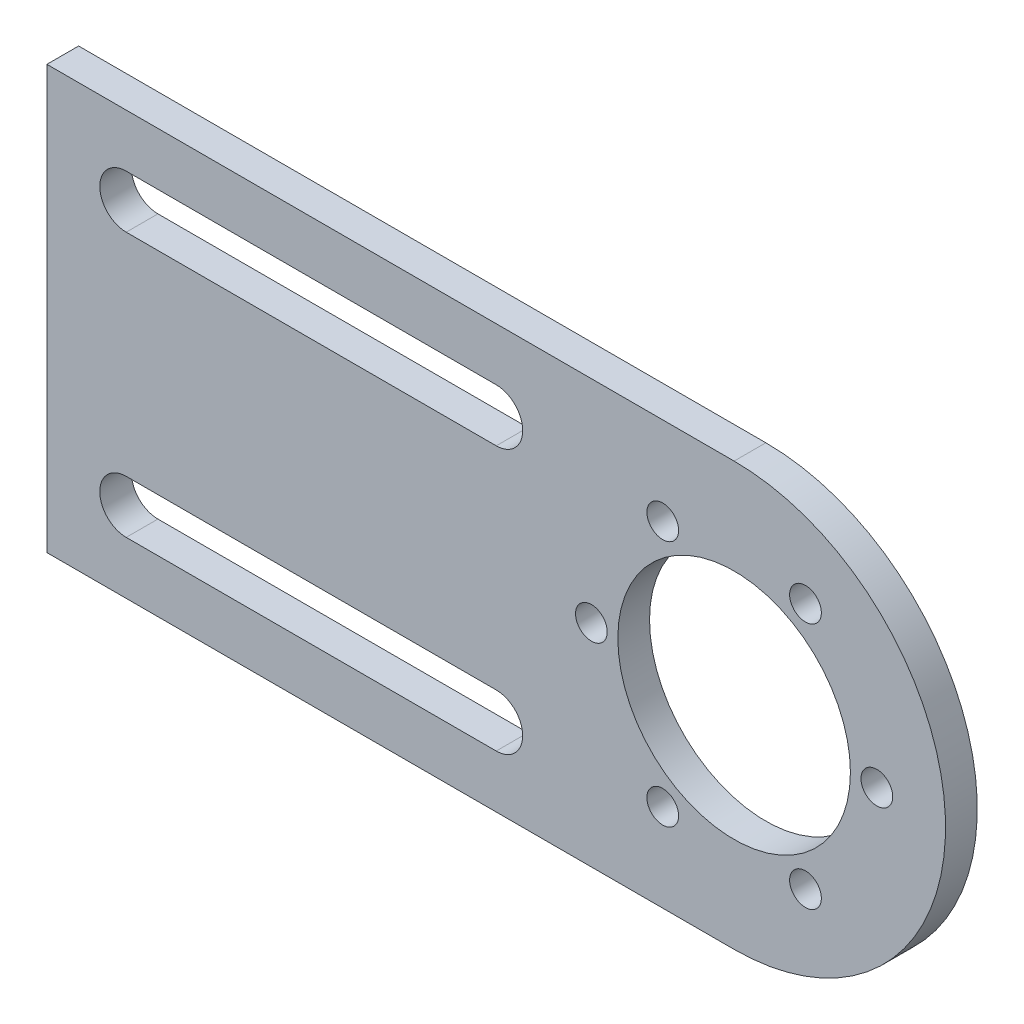
ISO-10303-21;
HEADER;
FILE_DESCRIPTION(('STEP AP214'),'2;1');
FILE_NAME('part.step','',(''),(''),'','','');
FILE_SCHEMA(('AUTOMOTIVE_DESIGN { 1 0 10303 214 1 1 1 1 }'));
ENDSEC;
DATA;
#1=APPLICATION_CONTEXT('core data for automotive mechanical design processes');
#2=APPLICATION_PROTOCOL_DEFINITION('international standard','automotive_design',2000,#1);
#3=PRODUCT_CONTEXT('',#1,'mechanical');
#4=PRODUCT('Part','Part','',(#3));
#5=PRODUCT_RELATED_PRODUCT_CATEGORY('part','',(#4));
#6=PRODUCT_DEFINITION_FORMATION('','',#4);
#7=PRODUCT_DEFINITION_CONTEXT('part definition',#1,'design');
#8=PRODUCT_DEFINITION('design','',#6,#7);
#9=PRODUCT_DEFINITION_SHAPE('','',#8);
#10=(LENGTH_UNIT() NAMED_UNIT(*) SI_UNIT(.MILLI.,.METRE.));
#11=(NAMED_UNIT(*) PLANE_ANGLE_UNIT() SI_UNIT($,.RADIAN.));
#12=(NAMED_UNIT(*) SI_UNIT($,.STERADIAN.) SOLID_ANGLE_UNIT());
#13=UNCERTAINTY_MEASURE_WITH_UNIT(LENGTH_MEASURE(1.E-05),#10,'distance_accuracy_value','');
#14=(GEOMETRIC_REPRESENTATION_CONTEXT(3) GLOBAL_UNCERTAINTY_ASSIGNED_CONTEXT((#13)) GLOBAL_UNIT_ASSIGNED_CONTEXT((#10,
#11,#12)) REPRESENTATION_CONTEXT('',''));
#15=CARTESIAN_POINT('',(0.,0.,0.));
#16=DIRECTION('',(0.,0.,1.));
#17=DIRECTION('',(1.,0.,0.));
#18=AXIS2_PLACEMENT_3D('',#15,#16,#17);
#19=CARTESIAN_POINT('',(32.5,0.,3.));
#20=DIRECTION('',(0.,0.,-1.));
#21=DIRECTION('',(-1.,0.,0.));
#22=AXIS2_PLACEMENT_3D('',#19,#20,#21);
#23=PLANE('',#22);
#24=CARTESIAN_POINT('',(39.2500000000001,11.6913429510898,3.));
#25=DIRECTION('',(0.,0.,1.));
#26=DIRECTION('',(0.50000000000001,0.866025403784433,0.));
#27=AXIS2_PLACEMENT_3D('',#24,#25,#26);
#28=CIRCLE('',#27,1.5);
#29=CARTESIAN_POINT('',(40.0000000000001,12.9903810567665,3.));
#30=VERTEX_POINT('',#29);
#31=EDGE_CURVE('E360',#30,#30,#28,.T.);
#32=ORIENTED_EDGE('',*,*,#31,.F.);
#33=EDGE_LOOP('',(#32));
#34=FACE_BOUND('',#33,.T.);
#35=CARTESIAN_POINT('',(25.7500000000001,11.69134295109,3.));
#36=DIRECTION('',(0.,0.,1.));
#37=DIRECTION('',(-0.499999999999992,0.866025403784443,0.));
#38=AXIS2_PLACEMENT_3D('',#35,#36,#37);
#39=CIRCLE('',#38,1.5);
#40=CARTESIAN_POINT('',(25.0000000000001,12.9903810567666,3.));
#41=VERTEX_POINT('',#40);
#42=EDGE_CURVE('E354',#41,#41,#39,.T.);
#43=ORIENTED_EDGE('',*,*,#42,.F.);
#44=EDGE_LOOP('',(#43));
#45=FACE_BOUND('',#44,.T.);
#46=CARTESIAN_POINT('',(19.,0.,3.));
#47=DIRECTION('',(0.,0.,1.));
#48=DIRECTION('',(-1.,0.,0.));
#49=AXIS2_PLACEMENT_3D('',#46,#47,#48);
#50=CIRCLE('',#49,1.5);
#51=CARTESIAN_POINT('',(17.5,0.,3.));
#52=VERTEX_POINT('',#51);
#53=EDGE_CURVE('E348',#52,#52,#50,.T.);
#54=ORIENTED_EDGE('',*,*,#53,.F.);
#55=EDGE_LOOP('',(#54));
#56=FACE_BOUND('',#55,.T.);
#57=CARTESIAN_POINT('',(25.7499999999999,-11.6913429510899,3.));
#58=DIRECTION('',(0.,0.,1.));
#59=DIRECTION('',(-0.500000000000004,-0.866025403784436,0.));
#60=AXIS2_PLACEMENT_3D('',#57,#58,#59);
#61=CIRCLE('',#60,1.5);
#62=CARTESIAN_POINT('',(24.9999999999999,-12.9903810567665,3.));
#63=VERTEX_POINT('',#62);
#64=EDGE_CURVE('E335',#63,#63,#61,.T.);
#65=ORIENTED_EDGE('',*,*,#64,.F.);
#66=EDGE_LOOP('',(#65));
#67=FACE_BOUND('',#66,.T.);
#68=CARTESIAN_POINT('',(39.25,-11.6913429510899,3.));
#69=DIRECTION('',(0.,0.,1.));
#70=DIRECTION('',(0.499999999999998,-0.86602540378444,0.));
#71=AXIS2_PLACEMENT_3D('',#68,#69,#70);
#72=CIRCLE('',#71,1.5);
#73=CARTESIAN_POINT('',(40.,-12.9903810567666,3.));
#74=VERTEX_POINT('',#73);
#75=EDGE_CURVE('E340',#74,#74,#72,.T.);
#76=ORIENTED_EDGE('',*,*,#75,.F.);
#77=EDGE_LOOP('',(#76));
#78=FACE_BOUND('',#77,.T.);
#79=CARTESIAN_POINT('',(46.,0.,3.));
#80=DIRECTION('',(0.,0.,1.));
#81=DIRECTION('',(1.,0.,0.));
#82=AXIS2_PLACEMENT_3D('',#79,#80,#81);
#83=CIRCLE('',#82,1.5);
#84=CARTESIAN_POINT('',(47.5,0.,3.));
#85=VERTEX_POINT('',#84);
#86=EDGE_CURVE('E367',#85,#85,#83,.T.);
#87=ORIENTED_EDGE('',*,*,#86,.F.);
#88=EDGE_LOOP('',(#87));
#89=FACE_BOUND('',#88,.T.);
#90=CARTESIAN_POINT('',(32.5,0.,3.));
#91=DIRECTION('',(0.,0.,1.));
#92=DIRECTION('',(1.,0.,0.));
#93=AXIS2_PLACEMENT_3D('',#90,#91,#92);
#94=CIRCLE('',#93,11.);
#95=CARTESIAN_POINT('',(43.5,0.,3.));
#96=VERTEX_POINT('',#95);
#97=EDGE_CURVE('E159',#96,#96,#94,.T.);
#98=ORIENTED_EDGE('',*,*,#97,.F.);
#99=EDGE_LOOP('',(#98));
#100=FACE_BOUND('',#99,.T.);
#101=CARTESIAN_POINT('',(-25.,12.5,3.));
#102=DIRECTION('',(0.,0.,1.));
#103=DIRECTION('',(-1.,0.,0.));
#104=AXIS2_PLACEMENT_3D('',#101,#102,#103);
#105=CIRCLE('',#104,2.5);
#106=CARTESIAN_POINT('',(-25.,15.,3.));
#107=VERTEX_POINT('',#106);
#108=CARTESIAN_POINT('',(-25.,9.99999999999999,3.));
#109=VERTEX_POINT('',#108);
#110=EDGE_CURVE('E165',#107,#109,#105,.T.);
#111=ORIENTED_EDGE('',*,*,#110,.F.);
#112=DIRECTION('',(-1.,0.,0.));
#113=VECTOR('',#112,1.);
#114=CARTESIAN_POINT('',(-25.,15.,3.));
#115=LINE('',#114,#113);
#116=CARTESIAN_POINT('',(9.99999999999999,15.,3.));
#117=VERTEX_POINT('',#116);
#118=EDGE_CURVE('E173',#117,#107,#115,.T.);
#119=ORIENTED_EDGE('',*,*,#118,.F.);
#120=CARTESIAN_POINT('',(9.99999999999999,12.5,3.));
#121=DIRECTION('',(0.,0.,1.));
#122=DIRECTION('',(-1.,0.,0.));
#123=AXIS2_PLACEMENT_3D('',#120,#121,#122);
#124=CIRCLE('',#123,2.5);
#125=CARTESIAN_POINT('',(9.99999999999999,9.99999999999999,3.));
#126=VERTEX_POINT('',#125);
#127=EDGE_CURVE('E170',#126,#117,#124,.T.);
#128=ORIENTED_EDGE('',*,*,#127,.F.);
#129=DIRECTION('',(1.,0.,0.));
#130=VECTOR('',#129,1.);
#131=CARTESIAN_POINT('',(9.99999999999999,9.99999999999999,3.));
#132=LINE('',#131,#130);
#133=EDGE_CURVE('E167',#109,#126,#132,.T.);
#134=ORIENTED_EDGE('',*,*,#133,.F.);
#135=EDGE_LOOP('',(#111,#119,#128,#134));
#136=FACE_BOUND('',#135,.T.);
#137=DIRECTION('',(0.,-1.,0.));
#138=VECTOR('',#137,1.);
#139=CARTESIAN_POINT('',(-32.5,20.,3.));
#140=LINE('',#139,#138);
#141=CARTESIAN_POINT('',(-32.5,20.,3.));
#142=VERTEX_POINT('',#141);
#143=CARTESIAN_POINT('',(-32.5,-20.,3.));
#144=VERTEX_POINT('',#143);
#145=EDGE_CURVE('E196',#142,#144,#140,.T.);
#146=ORIENTED_EDGE('',*,*,#145,.T.);
#147=DIRECTION('',(1.,0.,0.));
#148=VECTOR('',#147,1.);
#149=CARTESIAN_POINT('',(32.5,-20.,3.));
#150=LINE('',#149,#148);
#151=CARTESIAN_POINT('',(32.5,-20.,3.));
#152=VERTEX_POINT('',#151);
#153=EDGE_CURVE('E199',#144,#152,#150,.T.);
#154=ORIENTED_EDGE('',*,*,#153,.T.);
#155=CARTESIAN_POINT('',(32.5,0.,3.));
#156=DIRECTION('',(0.,0.,1.));
#157=DIRECTION('',(-1.,0.,0.));
#158=AXIS2_PLACEMENT_3D('',#155,#156,#157);
#159=CIRCLE('',#158,20.);
#160=CARTESIAN_POINT('',(32.5,20.,3.));
#161=VERTEX_POINT('',#160);
#162=EDGE_CURVE('E202',#152,#161,#159,.T.);
#163=ORIENTED_EDGE('',*,*,#162,.T.);
#164=DIRECTION('',(-1.,0.,0.));
#165=VECTOR('',#164,1.);
#166=CARTESIAN_POINT('',(32.5,20.,3.));
#167=LINE('',#166,#165);
#168=EDGE_CURVE('E204',#161,#142,#167,.T.);
#169=ORIENTED_EDGE('',*,*,#168,.T.);
#170=EDGE_LOOP('',(#146,#154,#163,#169));
#171=FACE_BOUND('',#170,.T.);
#172=CARTESIAN_POINT('',(-25.,-12.5,3.));
#173=DIRECTION('',(0.,0.,1.));
#174=DIRECTION('',(-1.,0.,0.));
#175=AXIS2_PLACEMENT_3D('',#172,#173,#174);
#176=CIRCLE('',#175,2.5);
#177=CARTESIAN_POINT('',(-25.,-10.,3.));
#178=VERTEX_POINT('',#177);
#179=CARTESIAN_POINT('',(-25.,-15.,3.));
#180=VERTEX_POINT('',#179);
#181=EDGE_CURVE('E121',#178,#180,#176,.T.);
#182=ORIENTED_EDGE('',*,*,#181,.F.);
#183=DIRECTION('',(-1.,0.,0.));
#184=VECTOR('',#183,1.);
#185=CARTESIAN_POINT('',(-25.,-10.,3.));
#186=LINE('',#185,#184);
#187=CARTESIAN_POINT('',(9.99999999999999,-10.,3.));
#188=VERTEX_POINT('',#187);
#189=EDGE_CURVE('E143',#188,#178,#186,.T.);
#190=ORIENTED_EDGE('',*,*,#189,.F.);
#191=CARTESIAN_POINT('',(9.99999999999999,-12.5,3.));
#192=DIRECTION('',(0.,0.,1.));
#193=DIRECTION('',(-1.,0.,0.));
#194=AXIS2_PLACEMENT_3D('',#191,#192,#193);
#195=CIRCLE('',#194,2.5);
#196=CARTESIAN_POINT('',(9.99999999999999,-15.,3.));
#197=VERTEX_POINT('',#196);
#198=EDGE_CURVE('E141',#197,#188,#195,.T.);
#199=ORIENTED_EDGE('',*,*,#198,.F.);
#200=DIRECTION('',(1.,0.,0.));
#201=VECTOR('',#200,1.);
#202=CARTESIAN_POINT('',(9.99999999999999,-15.,3.));
#203=LINE('',#202,#201);
#204=EDGE_CURVE('E129',#180,#197,#203,.T.);
#205=ORIENTED_EDGE('',*,*,#204,.F.);
#206=EDGE_LOOP('',(#182,#190,#199,#205));
#207=FACE_BOUND('',#206,.T.);
#208=ADVANCED_FACE('F32',(#34,#45,#56,#67,#78,#89,#100,#136,#171,#207),#23,.F.);
#209=CARTESIAN_POINT('',(32.5,0.,0.));
#210=DIRECTION('',(0.,0.,-1.));
#211=DIRECTION('',(-1.,0.,0.));
#212=AXIS2_PLACEMENT_3D('',#209,#210,#211);
#213=PLANE('',#212);
#214=CARTESIAN_POINT('',(39.2500000000001,11.6913429510898,0.));
#215=DIRECTION('',(0.,0.,-1.));
#216=DIRECTION('',(-1.,0.,0.));
#217=AXIS2_PLACEMENT_3D('',#214,#215,#216);
#218=CIRCLE('',#217,1.5);
#219=CARTESIAN_POINT('',(37.7500000000001,11.6913429510898,0.));
#220=VERTEX_POINT('',#219);
#221=EDGE_CURVE('E357',#220,#220,#218,.F.);
#222=ORIENTED_EDGE('',*,*,#221,.T.);
#223=EDGE_LOOP('',(#222));
#224=FACE_BOUND('',#223,.T.);
#225=CARTESIAN_POINT('',(25.7500000000001,11.69134295109,0.));
#226=DIRECTION('',(0.,0.,-1.));
#227=DIRECTION('',(-1.,0.,0.));
#228=AXIS2_PLACEMENT_3D('',#225,#226,#227);
#229=CIRCLE('',#228,1.5);
#230=CARTESIAN_POINT('',(24.2500000000001,11.69134295109,0.));
#231=VERTEX_POINT('',#230);
#232=EDGE_CURVE('E351',#231,#231,#229,.F.);
#233=ORIENTED_EDGE('',*,*,#232,.T.);
#234=EDGE_LOOP('',(#233));
#235=FACE_BOUND('',#234,.T.);
#236=CARTESIAN_POINT('',(19.,0.,0.));
#237=DIRECTION('',(0.,0.,-1.));
#238=DIRECTION('',(-1.,0.,0.));
#239=AXIS2_PLACEMENT_3D('',#236,#237,#238);
#240=CIRCLE('',#239,1.5);
#241=CARTESIAN_POINT('',(17.5,0.,0.));
#242=VERTEX_POINT('',#241);
#243=EDGE_CURVE('E345',#242,#242,#240,.F.);
#244=ORIENTED_EDGE('',*,*,#243,.T.);
#245=EDGE_LOOP('',(#244));
#246=FACE_BOUND('',#245,.T.);
#247=CARTESIAN_POINT('',(25.7499999999999,-11.6913429510899,0.));
#248=DIRECTION('',(0.,0.,-1.));
#249=DIRECTION('',(-1.,0.,0.));
#250=AXIS2_PLACEMENT_3D('',#247,#248,#249);
#251=CIRCLE('',#250,1.5);
#252=CARTESIAN_POINT('',(24.2499999999999,-11.6913429510899,0.));
#253=VERTEX_POINT('',#252);
#254=EDGE_CURVE('E338',#253,#253,#251,.F.);
#255=ORIENTED_EDGE('',*,*,#254,.T.);
#256=EDGE_LOOP('',(#255));
#257=FACE_BOUND('',#256,.T.);
#258=CARTESIAN_POINT('',(39.25,-11.6913429510899,0.));
#259=DIRECTION('',(0.,0.,-1.));
#260=DIRECTION('',(-1.,0.,0.));
#261=AXIS2_PLACEMENT_3D('',#258,#259,#260);
#262=CIRCLE('',#261,1.5);
#263=CARTESIAN_POINT('',(37.75,-11.6913429510899,0.));
#264=VERTEX_POINT('',#263);
#265=EDGE_CURVE('E343',#264,#264,#262,.F.);
#266=ORIENTED_EDGE('',*,*,#265,.T.);
#267=EDGE_LOOP('',(#266));
#268=FACE_BOUND('',#267,.T.);
#269=CARTESIAN_POINT('',(46.,0.,0.));
#270=DIRECTION('',(0.,0.,-1.));
#271=DIRECTION('',(-1.,0.,0.));
#272=AXIS2_PLACEMENT_3D('',#269,#270,#271);
#273=CIRCLE('',#272,1.5);
#274=CARTESIAN_POINT('',(44.5,0.,0.));
#275=VERTEX_POINT('',#274);
#276=EDGE_CURVE('E149',#275,#275,#273,.F.);
#277=ORIENTED_EDGE('',*,*,#276,.T.);
#278=EDGE_LOOP('',(#277));
#279=FACE_BOUND('',#278,.T.);
#280=DIRECTION('',(-1.,0.,0.));
#281=VECTOR('',#280,1.);
#282=CARTESIAN_POINT('',(-25.,15.,0.));
#283=LINE('',#282,#281);
#284=CARTESIAN_POINT('',(9.99999999999999,15.,0.));
#285=VERTEX_POINT('',#284);
#286=CARTESIAN_POINT('',(-25.,15.,0.));
#287=VERTEX_POINT('',#286);
#288=EDGE_CURVE('E168',#285,#287,#283,.T.);
#289=ORIENTED_EDGE('',*,*,#288,.T.);
#290=CARTESIAN_POINT('',(-25.,12.5,0.));
#291=DIRECTION('',(0.,0.,1.));
#292=DIRECTION('',(-1.,0.,0.));
#293=AXIS2_PLACEMENT_3D('',#290,#291,#292);
#294=CIRCLE('',#293,2.5);
#295=CARTESIAN_POINT('',(-25.,9.99999999999999,0.));
#296=VERTEX_POINT('',#295);
#297=EDGE_CURVE('E162',#287,#296,#294,.T.);
#298=ORIENTED_EDGE('',*,*,#297,.T.);
#299=DIRECTION('',(1.,0.,0.));
#300=VECTOR('',#299,1.);
#301=CARTESIAN_POINT('',(9.99999999999999,9.99999999999999,0.));
#302=LINE('',#301,#300);
#303=CARTESIAN_POINT('',(9.99999999999999,9.99999999999999,0.));
#304=VERTEX_POINT('',#303);
#305=EDGE_CURVE('E178',#296,#304,#302,.T.);
#306=ORIENTED_EDGE('',*,*,#305,.T.);
#307=CARTESIAN_POINT('',(9.99999999999999,12.5,0.));
#308=DIRECTION('',(0.,0.,1.));
#309=DIRECTION('',(-1.,0.,0.));
#310=AXIS2_PLACEMENT_3D('',#307,#308,#309);
#311=CIRCLE('',#310,2.5);
#312=EDGE_CURVE('E181',#304,#285,#311,.T.);
#313=ORIENTED_EDGE('',*,*,#312,.T.);
#314=EDGE_LOOP('',(#289,#298,#306,#313));
#315=FACE_BOUND('',#314,.T.);
#316=DIRECTION('',(0.,-1.,0.));
#317=VECTOR('',#316,1.);
#318=CARTESIAN_POINT('',(-32.5,20.,0.));
#319=LINE('',#318,#317);
#320=CARTESIAN_POINT('',(-32.5,20.,0.));
#321=VERTEX_POINT('',#320);
#322=CARTESIAN_POINT('',(-32.5,-20.,0.));
#323=VERTEX_POINT('',#322);
#324=EDGE_CURVE('E195',#321,#323,#319,.T.);
#325=ORIENTED_EDGE('',*,*,#324,.F.);
#326=DIRECTION('',(-1.,0.,0.));
#327=VECTOR('',#326,1.);
#328=CARTESIAN_POINT('',(32.5,20.,0.));
#329=LINE('',#328,#327);
#330=CARTESIAN_POINT('',(32.5,20.,0.));
#331=VERTEX_POINT('',#330);
#332=EDGE_CURVE('E200',#331,#321,#329,.T.);
#333=ORIENTED_EDGE('',*,*,#332,.F.);
#334=CARTESIAN_POINT('',(32.5,0.,0.));
#335=DIRECTION('',(0.,0.,1.));
#336=DIRECTION('',(-1.,0.,0.));
#337=AXIS2_PLACEMENT_3D('',#334,#335,#336);
#338=CIRCLE('',#337,20.);
#339=CARTESIAN_POINT('',(32.5,-20.,0.));
#340=VERTEX_POINT('',#339);
#341=EDGE_CURVE('E211',#340,#331,#338,.T.);
#342=ORIENTED_EDGE('',*,*,#341,.F.);
#343=DIRECTION('',(1.,0.,0.));
#344=VECTOR('',#343,1.);
#345=CARTESIAN_POINT('',(32.5,-20.,0.));
#346=LINE('',#345,#344);
#347=EDGE_CURVE('E209',#323,#340,#346,.T.);
#348=ORIENTED_EDGE('',*,*,#347,.F.);
#349=EDGE_LOOP('',(#325,#333,#342,#348));
#350=FACE_BOUND('',#349,.T.);
#351=CARTESIAN_POINT('',(32.5,0.,0.));
#352=DIRECTION('',(0.,0.,1.));
#353=DIRECTION('',(1.,0.,0.));
#354=AXIS2_PLACEMENT_3D('',#351,#352,#353);
#355=CIRCLE('',#354,11.);
#356=CARTESIAN_POINT('',(43.5,0.,0.));
#357=VERTEX_POINT('',#356);
#358=EDGE_CURVE('E137',#357,#357,#355,.T.);
#359=ORIENTED_EDGE('',*,*,#358,.T.);
#360=EDGE_LOOP('',(#359));
#361=FACE_BOUND('',#360,.T.);
#362=DIRECTION('',(-1.,0.,0.));
#363=VECTOR('',#362,1.);
#364=CARTESIAN_POINT('',(-25.,-10.,0.));
#365=LINE('',#364,#363);
#366=CARTESIAN_POINT('',(9.99999999999999,-10.,0.));
#367=VERTEX_POINT('',#366);
#368=CARTESIAN_POINT('',(-25.,-10.,0.));
#369=VERTEX_POINT('',#368);
#370=EDGE_CURVE('E130',#367,#369,#365,.T.);
#371=ORIENTED_EDGE('',*,*,#370,.T.);
#372=CARTESIAN_POINT('',(-25.,-12.5,0.));
#373=DIRECTION('',(0.,0.,1.));
#374=DIRECTION('',(-1.,0.,0.));
#375=AXIS2_PLACEMENT_3D('',#372,#373,#374);
#376=CIRCLE('',#375,2.5);
#377=CARTESIAN_POINT('',(-25.,-15.,0.));
#378=VERTEX_POINT('',#377);
#379=EDGE_CURVE('E55',#369,#378,#376,.T.);
#380=ORIENTED_EDGE('',*,*,#379,.T.);
#381=DIRECTION('',(1.,0.,0.));
#382=VECTOR('',#381,1.);
#383=CARTESIAN_POINT('',(9.99999999999999,-15.,0.));
#384=LINE('',#383,#382);
#385=CARTESIAN_POINT('',(9.99999999999999,-15.,0.));
#386=VERTEX_POINT('',#385);
#387=EDGE_CURVE('E136',#378,#386,#384,.T.);
#388=ORIENTED_EDGE('',*,*,#387,.T.);
#389=CARTESIAN_POINT('',(9.99999999999999,-12.5,0.));
#390=DIRECTION('',(0.,0.,1.));
#391=DIRECTION('',(-1.,0.,0.));
#392=AXIS2_PLACEMENT_3D('',#389,#390,#391);
#393=CIRCLE('',#392,2.5);
#394=EDGE_CURVE('E151',#386,#367,#393,.T.);
#395=ORIENTED_EDGE('',*,*,#394,.T.);
#396=EDGE_LOOP('',(#371,#380,#388,#395));
#397=FACE_BOUND('',#396,.T.);
#398=ADVANCED_FACE('F229',(#224,#235,#246,#257,#268,#279,#315,#350,#361,#397),#213,.T.);
#399=CARTESIAN_POINT('',(-32.5,20.,3.));
#400=DIRECTION('',(1.,0.,0.));
#401=DIRECTION('',(0.,1.,0.));
#402=AXIS2_PLACEMENT_3D('',#399,#400,#401);
#403=PLANE('',#402);
#404=ORIENTED_EDGE('',*,*,#324,.T.);
#405=DIRECTION('',(0.,0.,-1.));
#406=VECTOR('',#405,1.);
#407=CARTESIAN_POINT('',(-32.5,-20.,3.));
#408=LINE('',#407,#406);
#409=EDGE_CURVE('E11',#144,#323,#408,.T.);
#410=ORIENTED_EDGE('',*,*,#409,.F.);
#411=ORIENTED_EDGE('',*,*,#145,.F.);
#412=DIRECTION('',(0.,0.,-1.));
#413=VECTOR('',#412,1.);
#414=CARTESIAN_POINT('',(-32.5,20.,3.));
#415=LINE('',#414,#413);
#416=EDGE_CURVE('E206',#142,#321,#415,.T.);
#417=ORIENTED_EDGE('',*,*,#416,.T.);
#418=EDGE_LOOP('',(#404,#410,#411,#417));
#419=FACE_BOUND('',#418,.T.);
#420=ADVANCED_FACE('F34',(#419),#403,.F.);
#421=CARTESIAN_POINT('',(32.5,-20.,3.));
#422=DIRECTION('',(0.,1.,0.));
#423=DIRECTION('',(-1.,0.,0.));
#424=AXIS2_PLACEMENT_3D('',#421,#422,#423);
#425=PLANE('',#424);
#426=ORIENTED_EDGE('',*,*,#347,.T.);
#427=DIRECTION('',(0.,0.,-1.));
#428=VECTOR('',#427,1.);
#429=CARTESIAN_POINT('',(32.5,-20.,3.));
#430=LINE('',#429,#428);
#431=EDGE_CURVE('E40',#152,#340,#430,.T.);
#432=ORIENTED_EDGE('',*,*,#431,.F.);
#433=ORIENTED_EDGE('',*,*,#153,.F.);
#434=ORIENTED_EDGE('',*,*,#409,.T.);
#435=EDGE_LOOP('',(#426,#432,#433,#434));
#436=FACE_BOUND('',#435,.T.);
#437=ADVANCED_FACE('F239',(#436),#425,.F.);
#438=CARTESIAN_POINT('',(32.5,0.,3.));
#439=DIRECTION('',(0.,0.,-1.));
#440=DIRECTION('',(-1.,0.,0.));
#441=AXIS2_PLACEMENT_3D('',#438,#439,#440);
#442=CYLINDRICAL_SURFACE('',#441,20.);
#443=ORIENTED_EDGE('',*,*,#341,.T.);
#444=DIRECTION('',(0.,0.,-1.));
#445=VECTOR('',#444,1.);
#446=CARTESIAN_POINT('',(32.5,20.,3.));
#447=LINE('',#446,#445);
#448=EDGE_CURVE('E216',#161,#331,#447,.T.);
#449=ORIENTED_EDGE('',*,*,#448,.F.);
#450=ORIENTED_EDGE('',*,*,#162,.F.);
#451=ORIENTED_EDGE('',*,*,#431,.T.);
#452=EDGE_LOOP('',(#443,#449,#450,#451));
#453=FACE_BOUND('',#452,.T.);
#454=ADVANCED_FACE('F223',(#453),#442,.T.);
#455=CARTESIAN_POINT('',(32.5,20.,3.));
#456=DIRECTION('',(0.,-1.,0.));
#457=DIRECTION('',(1.,0.,0.));
#458=AXIS2_PLACEMENT_3D('',#455,#456,#457);
#459=PLANE('',#458);
#460=ORIENTED_EDGE('',*,*,#332,.T.);
#461=ORIENTED_EDGE('',*,*,#416,.F.);
#462=ORIENTED_EDGE('',*,*,#168,.F.);
#463=ORIENTED_EDGE('',*,*,#448,.T.);
#464=EDGE_LOOP('',(#460,#461,#462,#463));
#465=FACE_BOUND('',#464,.T.);
#466=ADVANCED_FACE('F233',(#465),#459,.F.);
#467=CARTESIAN_POINT('',(-25.,12.5,3.));
#468=DIRECTION('',(0.,0.,-1.));
#469=DIRECTION('',(-1.,0.,0.));
#470=AXIS2_PLACEMENT_3D('',#467,#468,#469);
#471=CYLINDRICAL_SURFACE('',#470,2.5);
#472=ORIENTED_EDGE('',*,*,#297,.F.);
#473=DIRECTION('',(0.,0.,-1.));
#474=VECTOR('',#473,1.);
#475=CARTESIAN_POINT('',(-25.,15.,3.));
#476=LINE('',#475,#474);
#477=EDGE_CURVE('E175',#107,#287,#476,.T.);
#478=ORIENTED_EDGE('',*,*,#477,.F.);
#479=ORIENTED_EDGE('',*,*,#110,.T.);
#480=DIRECTION('',(0.,0.,-1.));
#481=VECTOR('',#480,1.);
#482=CARTESIAN_POINT('',(-25.,9.99999999999999,3.));
#483=LINE('',#482,#481);
#484=EDGE_CURVE('E192',#109,#296,#483,.T.);
#485=ORIENTED_EDGE('',*,*,#484,.T.);
#486=EDGE_LOOP('',(#472,#478,#479,#485));
#487=FACE_BOUND('',#486,.T.);
#488=ADVANCED_FACE('F257',(#487),#471,.F.);
#489=CARTESIAN_POINT('',(9.99999999999999,9.99999999999999,3.));
#490=DIRECTION('',(0.,1.,0.));
#491=DIRECTION('',(-1.,0.,0.));
#492=AXIS2_PLACEMENT_3D('',#489,#490,#491);
#493=PLANE('',#492);
#494=ORIENTED_EDGE('',*,*,#305,.F.);
#495=ORIENTED_EDGE('',*,*,#484,.F.);
#496=ORIENTED_EDGE('',*,*,#133,.T.);
#497=DIRECTION('',(0.,0.,-1.));
#498=VECTOR('',#497,1.);
#499=CARTESIAN_POINT('',(9.99999999999999,9.99999999999999,3.));
#500=LINE('',#499,#498);
#501=EDGE_CURVE('E190',#126,#304,#500,.T.);
#502=ORIENTED_EDGE('',*,*,#501,.T.);
#503=EDGE_LOOP('',(#494,#495,#496,#502));
#504=FACE_BOUND('',#503,.T.);
#505=ADVANCED_FACE('F264',(#504),#493,.T.);
#506=CARTESIAN_POINT('',(9.99999999999999,12.5,3.));
#507=DIRECTION('',(0.,0.,-1.));
#508=DIRECTION('',(-1.,0.,0.));
#509=AXIS2_PLACEMENT_3D('',#506,#507,#508);
#510=CYLINDRICAL_SURFACE('',#509,2.5);
#511=ORIENTED_EDGE('',*,*,#312,.F.);
#512=ORIENTED_EDGE('',*,*,#501,.F.);
#513=ORIENTED_EDGE('',*,*,#127,.T.);
#514=DIRECTION('',(0.,0.,-1.));
#515=VECTOR('',#514,1.);
#516=CARTESIAN_POINT('',(9.99999999999999,15.,3.));
#517=LINE('',#516,#515);
#518=EDGE_CURVE('E188',#117,#285,#517,.T.);
#519=ORIENTED_EDGE('',*,*,#518,.T.);
#520=EDGE_LOOP('',(#511,#512,#513,#519));
#521=FACE_BOUND('',#520,.T.);
#522=ADVANCED_FACE('F269',(#521),#510,.F.);
#523=CARTESIAN_POINT('',(-25.,15.,3.));
#524=DIRECTION('',(0.,-1.,0.));
#525=DIRECTION('',(0.,0.,-1.));
#526=AXIS2_PLACEMENT_3D('',#523,#524,#525);
#527=PLANE('',#526);
#528=ORIENTED_EDGE('',*,*,#288,.F.);
#529=ORIENTED_EDGE('',*,*,#518,.F.);
#530=ORIENTED_EDGE('',*,*,#118,.T.);
#531=ORIENTED_EDGE('',*,*,#477,.T.);
#532=EDGE_LOOP('',(#528,#529,#530,#531));
#533=FACE_BOUND('',#532,.T.);
#534=ADVANCED_FACE('F277',(#533),#527,.T.);
#535=CARTESIAN_POINT('',(32.5,0.,3.));
#536=DIRECTION('',(0.,0.,-1.));
#537=DIRECTION('',(-1.,0.,0.));
#538=AXIS2_PLACEMENT_3D('',#535,#536,#537);
#539=CYLINDRICAL_SURFACE('',#538,11.);
#540=ORIENTED_EDGE('',*,*,#97,.T.);
#541=EDGE_LOOP('',(#540));
#542=FACE_BOUND('',#541,.T.);
#543=ORIENTED_EDGE('',*,*,#358,.F.);
#544=EDGE_LOOP('',(#543));
#545=FACE_BOUND('',#544,.T.);
#546=ADVANCED_FACE('F290',(#542,#545),#539,.F.);
#547=CARTESIAN_POINT('',(-25.,-12.5,3.));
#548=DIRECTION('',(0.,0.,-1.));
#549=DIRECTION('',(-1.,0.,0.));
#550=AXIS2_PLACEMENT_3D('',#547,#548,#549);
#551=CYLINDRICAL_SURFACE('',#550,2.5);
#552=ORIENTED_EDGE('',*,*,#379,.F.);
#553=DIRECTION('',(0.,0.,-1.));
#554=VECTOR('',#553,1.);
#555=CARTESIAN_POINT('',(-25.,-10.,3.));
#556=LINE('',#555,#554);
#557=EDGE_CURVE('E125',#178,#369,#556,.T.);
#558=ORIENTED_EDGE('',*,*,#557,.F.);
#559=ORIENTED_EDGE('',*,*,#181,.T.);
#560=DIRECTION('',(0.,0.,-1.));
#561=VECTOR('',#560,1.);
#562=CARTESIAN_POINT('',(-25.,-15.,3.));
#563=LINE('',#562,#561);
#564=EDGE_CURVE('E124',#180,#378,#563,.T.);
#565=ORIENTED_EDGE('',*,*,#564,.T.);
#566=EDGE_LOOP('',(#552,#558,#559,#565));
#567=FACE_BOUND('',#566,.T.);
#568=ADVANCED_FACE('F123',(#567),#551,.F.);
#569=CARTESIAN_POINT('',(9.99999999999999,-15.,3.));
#570=DIRECTION('',(0.,1.,0.));
#571=DIRECTION('',(-1.,0.,0.));
#572=AXIS2_PLACEMENT_3D('',#569,#570,#571);
#573=PLANE('',#572);
#574=ORIENTED_EDGE('',*,*,#387,.F.);
#575=ORIENTED_EDGE('',*,*,#564,.F.);
#576=ORIENTED_EDGE('',*,*,#204,.T.);
#577=DIRECTION('',(0.,0.,-1.));
#578=VECTOR('',#577,1.);
#579=CARTESIAN_POINT('',(9.99999999999999,-15.,3.));
#580=LINE('',#579,#578);
#581=EDGE_CURVE('E138',#197,#386,#580,.T.);
#582=ORIENTED_EDGE('',*,*,#581,.T.);
#583=EDGE_LOOP('',(#574,#575,#576,#582));
#584=FACE_BOUND('',#583,.T.);
#585=ADVANCED_FACE('F133',(#584),#573,.T.);
#586=CARTESIAN_POINT('',(9.99999999999999,-12.5,3.));
#587=DIRECTION('',(0.,0.,-1.));
#588=DIRECTION('',(-1.,0.,0.));
#589=AXIS2_PLACEMENT_3D('',#586,#587,#588);
#590=CYLINDRICAL_SURFACE('',#589,2.5);
#591=ORIENTED_EDGE('',*,*,#394,.F.);
#592=ORIENTED_EDGE('',*,*,#581,.F.);
#593=ORIENTED_EDGE('',*,*,#198,.T.);
#594=DIRECTION('',(0.,0.,-1.));
#595=VECTOR('',#594,1.);
#596=CARTESIAN_POINT('',(9.99999999999999,-10.,3.));
#597=LINE('',#596,#595);
#598=EDGE_CURVE('E47',#188,#367,#597,.T.);
#599=ORIENTED_EDGE('',*,*,#598,.T.);
#600=EDGE_LOOP('',(#591,#592,#593,#599));
#601=FACE_BOUND('',#600,.T.);
#602=ADVANCED_FACE('F300',(#601),#590,.F.);
#603=CARTESIAN_POINT('',(-25.,-10.,3.));
#604=DIRECTION('',(0.,-1.,0.));
#605=DIRECTION('',(1.,0.,0.));
#606=AXIS2_PLACEMENT_3D('',#603,#604,#605);
#607=PLANE('',#606);
#608=ORIENTED_EDGE('',*,*,#370,.F.);
#609=ORIENTED_EDGE('',*,*,#598,.F.);
#610=ORIENTED_EDGE('',*,*,#189,.T.);
#611=ORIENTED_EDGE('',*,*,#557,.T.);
#612=EDGE_LOOP('',(#608,#609,#610,#611));
#613=FACE_BOUND('',#612,.T.);
#614=ADVANCED_FACE('F303',(#613),#607,.T.);
#615=CARTESIAN_POINT('',(46.,0.,-4.24264068711929));
#616=DIRECTION('',(0.,0.,1.));
#617=DIRECTION('',(1.,0.,0.));
#618=AXIS2_PLACEMENT_3D('',#615,#616,#617);
#619=CYLINDRICAL_SURFACE('',#618,1.5);
#620=ORIENTED_EDGE('',*,*,#86,.T.);
#621=EDGE_LOOP('',(#620));
#622=FACE_BOUND('',#621,.T.);
#623=ORIENTED_EDGE('',*,*,#276,.F.);
#624=EDGE_LOOP('',(#623));
#625=FACE_BOUND('',#624,.T.);
#626=ADVANCED_FACE('F307',(#622,#625),#619,.F.);
#627=CARTESIAN_POINT('',(39.25,-11.6913429510899,-4.24264068711929));
#628=DIRECTION('',(0.,0.,1.));
#629=DIRECTION('',(1.,0.,0.));
#630=AXIS2_PLACEMENT_3D('',#627,#628,#629);
#631=CYLINDRICAL_SURFACE('',#630,1.5);
#632=ORIENTED_EDGE('',*,*,#75,.T.);
#633=EDGE_LOOP('',(#632));
#634=FACE_BOUND('',#633,.T.);
#635=ORIENTED_EDGE('',*,*,#265,.F.);
#636=EDGE_LOOP('',(#635));
#637=FACE_BOUND('',#636,.T.);
#638=ADVANCED_FACE('F310',(#634,#637),#631,.F.);
#639=CARTESIAN_POINT('',(25.7499999999999,-11.6913429510899,-4.2426406871193));
#640=DIRECTION('',(0.,0.,1.));
#641=DIRECTION('',(1.,0.,0.));
#642=AXIS2_PLACEMENT_3D('',#639,#640,#641);
#643=CYLINDRICAL_SURFACE('',#642,1.5);
#644=ORIENTED_EDGE('',*,*,#64,.T.);
#645=EDGE_LOOP('',(#644));
#646=FACE_BOUND('',#645,.T.);
#647=ORIENTED_EDGE('',*,*,#254,.F.);
#648=EDGE_LOOP('',(#647));
#649=FACE_BOUND('',#648,.T.);
#650=ADVANCED_FACE('F314',(#646,#649),#643,.F.);
#651=CARTESIAN_POINT('',(19.,0.,-4.2426406871193));
#652=DIRECTION('',(0.,0.,1.));
#653=DIRECTION('',(1.,0.,0.));
#654=AXIS2_PLACEMENT_3D('',#651,#652,#653);
#655=CYLINDRICAL_SURFACE('',#654,1.5);
#656=ORIENTED_EDGE('',*,*,#53,.T.);
#657=EDGE_LOOP('',(#656));
#658=FACE_BOUND('',#657,.T.);
#659=ORIENTED_EDGE('',*,*,#243,.F.);
#660=EDGE_LOOP('',(#659));
#661=FACE_BOUND('',#660,.T.);
#662=ADVANCED_FACE('F323',(#658,#661),#655,.F.);
#663=CARTESIAN_POINT('',(25.7500000000001,11.69134295109,-4.2426406871193));
#664=DIRECTION('',(0.,0.,1.));
#665=DIRECTION('',(1.,0.,0.));
#666=AXIS2_PLACEMENT_3D('',#663,#664,#665);
#667=CYLINDRICAL_SURFACE('',#666,1.5);
#668=ORIENTED_EDGE('',*,*,#42,.T.);
#669=EDGE_LOOP('',(#668));
#670=FACE_BOUND('',#669,.T.);
#671=ORIENTED_EDGE('',*,*,#232,.F.);
#672=EDGE_LOOP('',(#671));
#673=FACE_BOUND('',#672,.T.);
#674=ADVANCED_FACE('F319',(#670,#673),#667,.F.);
#675=CARTESIAN_POINT('',(39.2500000000001,11.6913429510898,-4.24264068711929));
#676=DIRECTION('',(0.,0.,1.));
#677=DIRECTION('',(1.,0.,0.));
#678=AXIS2_PLACEMENT_3D('',#675,#676,#677);
#679=CYLINDRICAL_SURFACE('',#678,1.5);
#680=ORIENTED_EDGE('',*,*,#31,.T.);
#681=EDGE_LOOP('',(#680));
#682=FACE_BOUND('',#681,.T.);
#683=ORIENTED_EDGE('',*,*,#221,.F.);
#684=EDGE_LOOP('',(#683));
#685=FACE_BOUND('',#684,.T.);
#686=ADVANCED_FACE('F316',(#682,#685),#679,.F.);
#687=CLOSED_SHELL('',(#208,#398,#420,#437,#454,#466,#488,#505,#522,#534,#546,#568,#585,#602,
#614,#626,#638,#650,#662,#674,#686));
#688=MANIFOLD_SOLID_BREP('B2',#687);
#689=ADVANCED_BREP_SHAPE_REPRESENTATION('',(#18,#688),#14);
#690=SHAPE_DEFINITION_REPRESENTATION(#9,#689);
ENDSEC;
END-ISO-10303-21;
